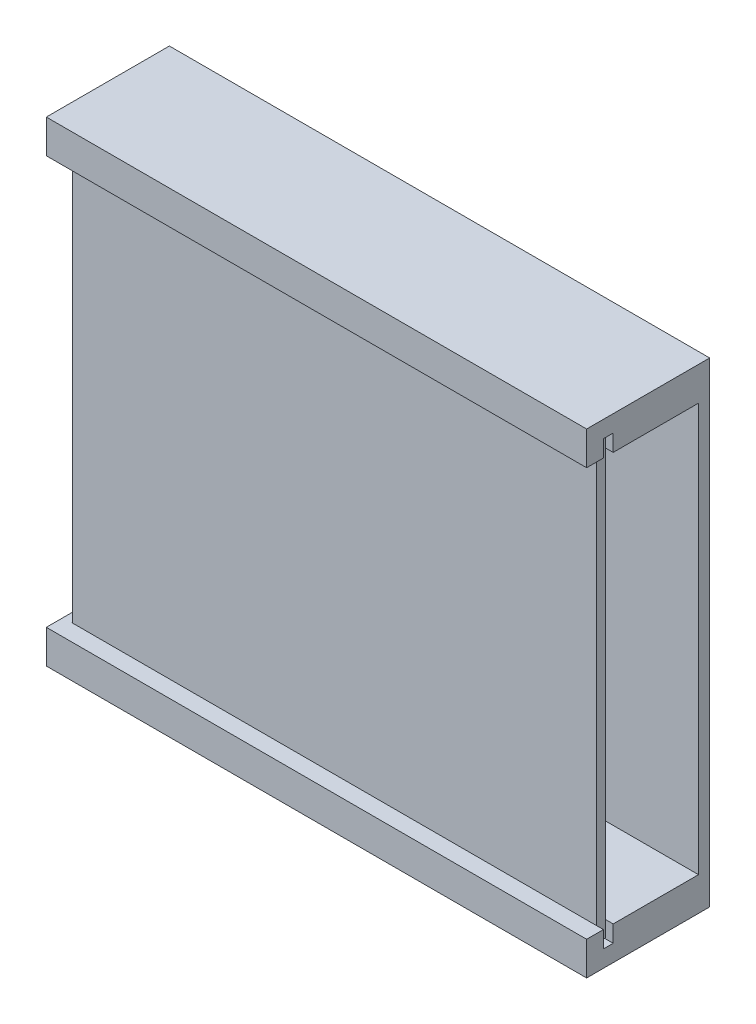
ISO-10303-21;
HEADER;
FILE_DESCRIPTION(('STEP AP214'),'2;1');
FILE_NAME('part.step','',(''),(''),'','','');
FILE_SCHEMA(('AUTOMOTIVE_DESIGN { 1 0 10303 214 1 1 1 1 }'));
ENDSEC;
DATA;
#1=APPLICATION_CONTEXT('core data for automotive mechanical design processes');
#2=APPLICATION_PROTOCOL_DEFINITION('international standard','automotive_design',2000,#1);
#3=PRODUCT_CONTEXT('',#1,'mechanical');
#4=PRODUCT('Part','Part','',(#3));
#5=PRODUCT_RELATED_PRODUCT_CATEGORY('part','',(#4));
#6=PRODUCT_DEFINITION_FORMATION('','',#4);
#7=PRODUCT_DEFINITION_CONTEXT('part definition',#1,'design');
#8=PRODUCT_DEFINITION('design','',#6,#7);
#9=PRODUCT_DEFINITION_SHAPE('','',#8);
#10=(LENGTH_UNIT() NAMED_UNIT(*) SI_UNIT(.MILLI.,.METRE.));
#11=(NAMED_UNIT(*) PLANE_ANGLE_UNIT() SI_UNIT($,.RADIAN.));
#12=(NAMED_UNIT(*) SI_UNIT($,.STERADIAN.) SOLID_ANGLE_UNIT());
#13=UNCERTAINTY_MEASURE_WITH_UNIT(LENGTH_MEASURE(1.E-05),#10,'distance_accuracy_value','');
#14=(GEOMETRIC_REPRESENTATION_CONTEXT(3) GLOBAL_UNCERTAINTY_ASSIGNED_CONTEXT((#13)) GLOBAL_UNIT_ASSIGNED_CONTEXT((#10,
#11,#12)) REPRESENTATION_CONTEXT('',''));
#15=CARTESIAN_POINT('',(0.,0.,0.));
#16=DIRECTION('',(0.,0.,1.));
#17=DIRECTION('',(1.,0.,0.));
#18=AXIS2_PLACEMENT_3D('',#15,#16,#17);
#19=CARTESIAN_POINT('',(130.687,37.8405198294598,1.675));
#20=DIRECTION('',(0.,1.,0.));
#21=DIRECTION('',(0.,0.,1.));
#22=AXIS2_PLACEMENT_3D('',#19,#20,#21);
#23=PLANE('',#22);
#24=DIRECTION('',(0.,0.,-1.));
#25=VECTOR('',#24,1.);
#26=CARTESIAN_POINT('',(35.687,37.8405198294598,1.675));
#27=LINE('',#26,#25);
#28=CARTESIAN_POINT('',(35.687,37.8405198294598,1.675));
#29=VERTEX_POINT('',#28);
#30=CARTESIAN_POINT('',(35.687,37.8405198294598,-0.0749999999999998));
#31=VERTEX_POINT('',#30);
#32=EDGE_CURVE('E12',#29,#31,#27,.T.);
#33=ORIENTED_EDGE('',*,*,#32,.F.);
#34=DIRECTION('',(-1.,0.,0.));
#35=VECTOR('',#34,1.);
#36=CARTESIAN_POINT('',(130.687,37.8405198294598,1.675));
#37=LINE('',#36,#35);
#38=CARTESIAN_POINT('',(130.687,37.8405198294598,1.675));
#39=VERTEX_POINT('',#38);
#40=EDGE_CURVE('E324',#39,#29,#37,.T.);
#41=ORIENTED_EDGE('',*,*,#40,.F.);
#42=DIRECTION('',(0.,0.,-1.));
#43=VECTOR('',#42,1.);
#44=CARTESIAN_POINT('',(130.687,37.8405198294598,1.675));
#45=LINE('',#44,#43);
#46=CARTESIAN_POINT('',(130.687,37.8405198294598,-0.0749999999999996));
#47=VERTEX_POINT('',#46);
#48=EDGE_CURVE('E67',#39,#47,#45,.T.);
#49=ORIENTED_EDGE('',*,*,#48,.T.);
#50=DIRECTION('',(-1.,0.,0.));
#51=VECTOR('',#50,1.);
#52=CARTESIAN_POINT('',(130.687,37.8405198294598,-0.0749999999999996));
#53=LINE('',#52,#51);
#54=EDGE_CURVE('E81',#47,#31,#53,.T.);
#55=ORIENTED_EDGE('',*,*,#54,.T.);
#56=EDGE_LOOP('',(#33,#41,#49,#55));
#57=FACE_BOUND('',#56,.T.);
#58=ADVANCED_FACE('F63',(#57),#23,.T.);
#59=CARTESIAN_POINT('',(130.687,40.8405198294598,1.675));
#60=DIRECTION('',(0.,0.,-1.));
#61=DIRECTION('',(-1.,0.,0.));
#62=AXIS2_PLACEMENT_3D('',#59,#60,#61);
#63=PLANE('',#62);
#64=DIRECTION('',(0.,-1.,0.));
#65=VECTOR('',#64,1.);
#66=CARTESIAN_POINT('',(35.687,40.8405198294598,1.675));
#67=LINE('',#66,#65);
#68=CARTESIAN_POINT('',(35.687,40.8405198294598,1.675));
#69=VERTEX_POINT('',#68);
#70=EDGE_CURVE('E357',#69,#29,#67,.T.);
#71=ORIENTED_EDGE('',*,*,#70,.F.);
#72=DIRECTION('',(-1.,0.,0.));
#73=VECTOR('',#72,1.);
#74=CARTESIAN_POINT('',(130.687,40.8405198294598,1.675));
#75=LINE('',#74,#73);
#76=CARTESIAN_POINT('',(130.687,40.8405198294598,1.675));
#77=VERTEX_POINT('',#76);
#78=EDGE_CURVE('E351',#77,#69,#75,.T.);
#79=ORIENTED_EDGE('',*,*,#78,.F.);
#80=DIRECTION('',(0.,-1.,0.));
#81=VECTOR('',#80,1.);
#82=CARTESIAN_POINT('',(130.687,40.8405198294598,1.675));
#83=LINE('',#82,#81);
#84=EDGE_CURVE('E338',#77,#39,#83,.T.);
#85=ORIENTED_EDGE('',*,*,#84,.T.);
#86=ORIENTED_EDGE('',*,*,#40,.T.);
#87=EDGE_LOOP('',(#71,#79,#85,#86));
#88=FACE_BOUND('',#87,.T.);
#89=ADVANCED_FACE('F395',(#88),#63,.T.);
#90=CARTESIAN_POINT('',(130.687,40.8405198294598,4.675));
#91=DIRECTION('',(0.,1.,0.));
#92=DIRECTION('',(0.,0.,1.));
#93=AXIS2_PLACEMENT_3D('',#90,#91,#92);
#94=PLANE('',#93);
#95=ORIENTED_EDGE('',*,*,#78,.T.);
#96=DIRECTION('',(0.,0.,-1.));
#97=VECTOR('',#96,1.);
#98=CARTESIAN_POINT('',(35.687,40.8405198294598,-15.325));
#99=LINE('',#98,#97);
#100=CARTESIAN_POINT('',(35.687,40.8405198294598,-0.0749999999999987));
#101=VERTEX_POINT('',#100);
#102=EDGE_CURVE('E321',#69,#101,#99,.T.);
#103=ORIENTED_EDGE('',*,*,#102,.T.);
#104=DIRECTION('',(-1.,0.,0.));
#105=VECTOR('',#104,1.);
#106=CARTESIAN_POINT('',(130.687,40.8405198294598,-0.0749999999999992));
#107=LINE('',#106,#105);
#108=CARTESIAN_POINT('',(130.687,40.8405198294598,-0.0749999999999992));
#109=VERTEX_POINT('',#108);
#110=EDGE_CURVE('E89',#109,#101,#107,.T.);
#111=ORIENTED_EDGE('',*,*,#110,.F.);
#112=DIRECTION('',(0.,0.,-1.));
#113=VECTOR('',#112,1.);
#114=CARTESIAN_POINT('',(130.687,40.8405198294598,-0.0749999999999992));
#115=LINE('',#114,#113);
#116=CARTESIAN_POINT('',(130.687,40.8405198294598,-15.325));
#117=VERTEX_POINT('',#116);
#118=EDGE_CURVE('E377',#109,#117,#115,.T.);
#119=ORIENTED_EDGE('',*,*,#118,.T.);
#120=DIRECTION('',(-1.,0.,0.));
#121=VECTOR('',#120,1.);
#122=CARTESIAN_POINT('',(130.687,40.8405198294598,-15.325));
#123=LINE('',#122,#121);
#124=CARTESIAN_POINT('',(112.469351456297,40.8405198294598,-15.325));
#125=VERTEX_POINT('',#124);
#126=EDGE_CURVE('E341',#117,#125,#123,.T.);
#127=ORIENTED_EDGE('',*,*,#126,.T.);
#128=DIRECTION('',(0.,0.,1.));
#129=VECTOR('',#128,1.);
#130=CARTESIAN_POINT('',(112.469351456297,40.8405198294598,-17.325));
#131=LINE('',#130,#129);
#132=CARTESIAN_POINT('',(112.469351456297,40.8405198294598,-17.325));
#133=VERTEX_POINT('',#132);
#134=EDGE_CURVE('E213',#133,#125,#131,.T.);
#135=ORIENTED_EDGE('',*,*,#134,.F.);
#136=DIRECTION('',(1.,0.,0.));
#137=VECTOR('',#136,1.);
#138=CARTESIAN_POINT('',(0.,40.8405198294598,-17.325));
#139=LINE('',#138,#137);
#140=CARTESIAN_POINT('',(47.0493676342301,40.8405198294598,-17.325));
#141=VERTEX_POINT('',#140);
#142=EDGE_CURVE('E205',#141,#133,#139,.T.);
#143=ORIENTED_EDGE('',*,*,#142,.F.);
#144=DIRECTION('',(0.,0.,1.));
#145=VECTOR('',#144,1.);
#146=CARTESIAN_POINT('',(47.0493676342301,40.8405198294598,-17.325));
#147=LINE('',#146,#145);
#148=CARTESIAN_POINT('',(47.0493676342301,40.8405198294598,-15.325));
#149=VERTEX_POINT('',#148);
#150=EDGE_CURVE('E210',#141,#149,#147,.T.);
#151=ORIENTED_EDGE('',*,*,#150,.T.);
#152=CARTESIAN_POINT('',(34.087,40.8405198294598,-15.325));
#153=VERTEX_POINT('',#152);
#154=EDGE_CURVE('E344',#149,#153,#123,.T.);
#155=ORIENTED_EDGE('',*,*,#154,.T.);
#156=DIRECTION('',(0.,0.,-1.));
#157=VECTOR('',#156,1.);
#158=CARTESIAN_POINT('',(34.087,40.8405198294598,-15.325));
#159=LINE('',#158,#157);
#160=CARTESIAN_POINT('',(34.087,40.8405198294598,4.675));
#161=VERTEX_POINT('',#160);
#162=EDGE_CURVE('E302',#161,#153,#159,.T.);
#163=ORIENTED_EDGE('',*,*,#162,.F.);
#164=DIRECTION('',(-1.,0.,0.));
#165=VECTOR('',#164,1.);
#166=CARTESIAN_POINT('',(130.687,40.8405198294598,4.675));
#167=LINE('',#166,#165);
#168=CARTESIAN_POINT('',(130.687,40.8405198294598,4.675));
#169=VERTEX_POINT('',#168);
#170=EDGE_CURVE('E348',#169,#161,#167,.T.);
#171=ORIENTED_EDGE('',*,*,#170,.F.);
#172=DIRECTION('',(0.,0.,-1.));
#173=VECTOR('',#172,1.);
#174=CARTESIAN_POINT('',(130.687,40.8405198294598,4.675));
#175=LINE('',#174,#173);
#176=EDGE_CURVE('E365',#169,#77,#175,.T.);
#177=ORIENTED_EDGE('',*,*,#176,.T.);
#178=EDGE_LOOP('',(#95,#103,#111,#119,#127,#135,#143,#151,#155,#163,#171,#177));
#179=FACE_BOUND('',#178,.T.);
#180=ADVANCED_FACE('F208',(#179),#94,.T.);
#181=CARTESIAN_POINT('',(130.687,34.8405198294598,4.675));
#182=DIRECTION('',(0.,0.,1.));
#183=DIRECTION('',(0.,-1.,0.));
#184=AXIS2_PLACEMENT_3D('',#181,#182,#183);
#185=PLANE('',#184);
#186=ORIENTED_EDGE('',*,*,#170,.T.);
#187=DIRECTION('',(0.,1.,0.));
#188=VECTOR('',#187,1.);
#189=CARTESIAN_POINT('',(34.087,34.8405198294598,4.675));
#190=LINE('',#189,#188);
#191=CARTESIAN_POINT('',(34.087,34.8405198294598,4.675));
#192=VERTEX_POINT('',#191);
#193=EDGE_CURVE('E329',#192,#161,#190,.T.);
#194=ORIENTED_EDGE('',*,*,#193,.F.);
#195=DIRECTION('',(-1.,0.,0.));
#196=VECTOR('',#195,1.);
#197=CARTESIAN_POINT('',(130.687,34.8405198294598,4.675));
#198=LINE('',#197,#196);
#199=CARTESIAN_POINT('',(130.687,34.8405198294598,4.675));
#200=VERTEX_POINT('',#199);
#201=EDGE_CURVE('E345',#200,#192,#198,.T.);
#202=ORIENTED_EDGE('',*,*,#201,.F.);
#203=DIRECTION('',(0.,1.,0.));
#204=VECTOR('',#203,1.);
#205=CARTESIAN_POINT('',(130.687,34.8405198294598,4.675));
#206=LINE('',#205,#204);
#207=EDGE_CURVE('E369',#200,#169,#206,.T.);
#208=ORIENTED_EDGE('',*,*,#207,.T.);
#209=EDGE_LOOP('',(#186,#194,#202,#208));
#210=FACE_BOUND('',#209,.T.);
#211=ADVANCED_FACE('F399',(#210),#185,.T.);
#212=CARTESIAN_POINT('',(130.687,34.8405198294598,-15.325));
#213=DIRECTION('',(0.,-1.,0.));
#214=DIRECTION('',(0.,0.,-1.));
#215=AXIS2_PLACEMENT_3D('',#212,#213,#214);
#216=PLANE('',#215);
#217=ORIENTED_EDGE('',*,*,#201,.T.);
#218=DIRECTION('',(0.,0.,1.));
#219=VECTOR('',#218,1.);
#220=CARTESIAN_POINT('',(34.087,34.8405198294598,-15.325));
#221=LINE('',#220,#219);
#222=CARTESIAN_POINT('',(34.087,34.8405198294598,-17.325));
#223=VERTEX_POINT('',#222);
#224=EDGE_CURVE('E325',#223,#192,#221,.T.);
#225=ORIENTED_EDGE('',*,*,#224,.F.);
#226=DIRECTION('',(-1.,0.,0.));
#227=VECTOR('',#226,1.);
#228=CARTESIAN_POINT('',(0.,34.8405198294598,-17.325));
#229=LINE('',#228,#227);
#230=CARTESIAN_POINT('',(130.687,34.8405198294598,-17.325));
#231=VERTEX_POINT('',#230);
#232=EDGE_CURVE('E406',#231,#223,#229,.T.);
#233=ORIENTED_EDGE('',*,*,#232,.F.);
#234=DIRECTION('',(0.,0.,1.));
#235=VECTOR('',#234,1.);
#236=CARTESIAN_POINT('',(130.687,34.8405198294598,-15.325));
#237=LINE('',#236,#235);
#238=EDGE_CURVE('E373',#231,#200,#237,.T.);
#239=ORIENTED_EDGE('',*,*,#238,.T.);
#240=EDGE_LOOP('',(#217,#225,#233,#239));
#241=FACE_BOUND('',#240,.T.);
#242=ADVANCED_FACE('F402',(#241),#216,.T.);
#243=CARTESIAN_POINT('',(130.687,37.8405198294598,-0.0749999999999996));
#244=DIRECTION('',(0.,0.,1.));
#245=DIRECTION('',(0.,-1.,0.));
#246=AXIS2_PLACEMENT_3D('',#243,#244,#245);
#247=PLANE('',#246);
#248=DIRECTION('',(0.,1.,0.));
#249=VECTOR('',#248,1.);
#250=CARTESIAN_POINT('',(35.687,37.8405198294598,-0.0749999999999996));
#251=LINE('',#250,#249);
#252=EDGE_CURVE('E73',#31,#101,#251,.T.);
#253=ORIENTED_EDGE('',*,*,#252,.F.);
#254=ORIENTED_EDGE('',*,*,#54,.F.);
#255=DIRECTION('',(0.,1.,0.));
#256=VECTOR('',#255,1.);
#257=CARTESIAN_POINT('',(130.687,37.8405198294598,-0.0749999999999996));
#258=LINE('',#257,#256);
#259=EDGE_CURVE('E379',#47,#109,#258,.T.);
#260=ORIENTED_EDGE('',*,*,#259,.T.);
#261=ORIENTED_EDGE('',*,*,#110,.T.);
#262=EDGE_LOOP('',(#253,#254,#260,#261));
#263=FACE_BOUND('',#262,.T.);
#264=ADVANCED_FACE('F568',(#263),#247,.T.);
#265=CARTESIAN_POINT('',(130.687,0.,0.));
#266=DIRECTION('',(1.,0.,0.));
#267=DIRECTION('',(0.,0.,-1.));
#268=AXIS2_PLACEMENT_3D('',#265,#266,#267);
#269=PLANE('',#268);
#270=ORIENTED_EDGE('',*,*,#48,.F.);
#271=ORIENTED_EDGE('',*,*,#84,.F.);
#272=ORIENTED_EDGE('',*,*,#176,.F.);
#273=ORIENTED_EDGE('',*,*,#207,.F.);
#274=ORIENTED_EDGE('',*,*,#238,.F.);
#275=DIRECTION('',(0.,-1.,0.));
#276=VECTOR('',#275,1.);
#277=CARTESIAN_POINT('',(130.687,0.,-17.325));
#278=LINE('',#277,#276);
#279=CARTESIAN_POINT('',(130.687,119.84548017054,-17.325));
#280=VERTEX_POINT('',#279);
#281=EDGE_CURVE('E410',#280,#231,#278,.T.);
#282=ORIENTED_EDGE('',*,*,#281,.F.);
#283=DIRECTION('',(0.,0.,-1.));
#284=VECTOR('',#283,1.);
#285=CARTESIAN_POINT('',(130.687,119.84548017054,-15.325));
#286=LINE('',#285,#284);
#287=CARTESIAN_POINT('',(130.687,119.84548017054,4.675));
#288=VERTEX_POINT('',#287);
#289=EDGE_CURVE('E281',#288,#280,#286,.T.);
#290=ORIENTED_EDGE('',*,*,#289,.F.);
#291=DIRECTION('',(0.,1.,0.));
#292=VECTOR('',#291,1.);
#293=CARTESIAN_POINT('',(130.687,119.84548017054,4.675));
#294=LINE('',#293,#292);
#295=CARTESIAN_POINT('',(130.687,113.84548017054,4.675));
#296=VERTEX_POINT('',#295);
#297=EDGE_CURVE('E277',#296,#288,#294,.T.);
#298=ORIENTED_EDGE('',*,*,#297,.F.);
#299=DIRECTION('',(0.,0.,1.));
#300=VECTOR('',#299,1.);
#301=CARTESIAN_POINT('',(130.687,113.84548017054,4.675));
#302=LINE('',#301,#300);
#303=CARTESIAN_POINT('',(130.687,113.84548017054,1.675));
#304=VERTEX_POINT('',#303);
#305=EDGE_CURVE('E273',#304,#296,#302,.T.);
#306=ORIENTED_EDGE('',*,*,#305,.F.);
#307=DIRECTION('',(0.,-1.,0.));
#308=VECTOR('',#307,1.);
#309=CARTESIAN_POINT('',(130.687,113.84548017054,1.675));
#310=LINE('',#309,#308);
#311=CARTESIAN_POINT('',(130.687,116.84548017054,1.675));
#312=VERTEX_POINT('',#311);
#313=EDGE_CURVE('E269',#312,#304,#310,.T.);
#314=ORIENTED_EDGE('',*,*,#313,.F.);
#315=DIRECTION('',(0.,0.,1.));
#316=VECTOR('',#315,1.);
#317=CARTESIAN_POINT('',(130.687,116.84548017054,1.675));
#318=LINE('',#317,#316);
#319=CARTESIAN_POINT('',(130.687,116.84548017054,-0.0749999999999996));
#320=VERTEX_POINT('',#319);
#321=EDGE_CURVE('E264',#320,#312,#318,.T.);
#322=ORIENTED_EDGE('',*,*,#321,.F.);
#323=DIRECTION('',(0.,1.,0.));
#324=VECTOR('',#323,1.);
#325=CARTESIAN_POINT('',(130.687,116.84548017054,-0.0749999999999996));
#326=LINE('',#325,#324);
#327=CARTESIAN_POINT('',(130.687,113.84548017054,-0.0749999999999992));
#328=VERTEX_POINT('',#327);
#329=EDGE_CURVE('E260',#328,#320,#326,.T.);
#330=ORIENTED_EDGE('',*,*,#329,.F.);
#331=DIRECTION('',(0.,0.,1.));
#332=VECTOR('',#331,1.);
#333=CARTESIAN_POINT('',(130.687,113.84548017054,-0.0749999999999992));
#334=LINE('',#333,#332);
#335=CARTESIAN_POINT('',(130.687,113.84548017054,-15.325));
#336=VERTEX_POINT('',#335);
#337=EDGE_CURVE('E284',#336,#328,#334,.T.);
#338=ORIENTED_EDGE('',*,*,#337,.F.);
#339=DIRECTION('',(0.,-1.,0.));
#340=VECTOR('',#339,1.);
#341=CARTESIAN_POINT('',(130.687,0.,-15.325));
#342=LINE('',#341,#340);
#343=EDGE_CURVE('E230',#336,#117,#342,.T.);
#344=ORIENTED_EDGE('',*,*,#343,.T.);
#345=ORIENTED_EDGE('',*,*,#118,.F.);
#346=ORIENTED_EDGE('',*,*,#259,.F.);
#347=EDGE_LOOP('',(#270,#271,#272,#273,#274,#282,#290,#298,#306,#314,#322,#330,#338,#344,#345,#346));
#348=FACE_BOUND('',#347,.T.);
#349=ADVANCED_FACE('F65',(#348),#269,.T.);
#350=CARTESIAN_POINT('',(35.687,0.,0.));
#351=DIRECTION('',(-1.,0.,0.));
#352=DIRECTION('',(0.,0.,1.));
#353=AXIS2_PLACEMENT_3D('',#350,#351,#352);
#354=PLANE('',#353);
#355=ORIENTED_EDGE('',*,*,#32,.T.);
#356=ORIENTED_EDGE('',*,*,#252,.T.);
#357=ORIENTED_EDGE('',*,*,#102,.F.);
#358=ORIENTED_EDGE('',*,*,#70,.T.);
#359=EDGE_LOOP('',(#355,#356,#357,#358));
#360=FACE_BOUND('',#359,.T.);
#361=ADVANCED_FACE('F561',(#360),#354,.F.);
#362=CARTESIAN_POINT('',(0.,0.,-15.325));
#363=DIRECTION('',(0.,0.,-1.));
#364=DIRECTION('',(-1.,0.,0.));
#365=AXIS2_PLACEMENT_3D('',#362,#363,#364);
#366=PLANE('',#365);
#367=ORIENTED_EDGE('',*,*,#126,.F.);
#368=ORIENTED_EDGE('',*,*,#343,.F.);
#369=DIRECTION('',(-1.,0.,0.));
#370=VECTOR('',#369,1.);
#371=CARTESIAN_POINT('',(130.687,113.84548017054,-15.325));
#372=LINE('',#371,#370);
#373=CARTESIAN_POINT('',(112.469351456297,113.84548017054,-15.325));
#374=VERTEX_POINT('',#373);
#375=EDGE_CURVE('E303',#336,#374,#372,.T.);
#376=ORIENTED_EDGE('',*,*,#375,.T.);
#377=DIRECTION('',(0.,-1.,0.));
#378=VECTOR('',#377,1.);
#379=CARTESIAN_POINT('',(112.469351456297,0.,-15.325));
#380=LINE('',#379,#378);
#381=EDGE_CURVE('E429',#374,#125,#380,.T.);
#382=ORIENTED_EDGE('',*,*,#381,.T.);
#383=EDGE_LOOP('',(#367,#368,#376,#382));
#384=FACE_BOUND('',#383,.T.);
#385=ADVANCED_FACE('F449',(#384),#366,.F.);
#386=CARTESIAN_POINT('',(34.087,0.,0.));
#387=DIRECTION('',(-1.,0.,0.));
#388=DIRECTION('',(0.,0.,1.));
#389=AXIS2_PLACEMENT_3D('',#386,#387,#388);
#390=PLANE('',#389);
#391=ORIENTED_EDGE('',*,*,#224,.T.);
#392=ORIENTED_EDGE('',*,*,#193,.T.);
#393=ORIENTED_EDGE('',*,*,#162,.T.);
#394=DIRECTION('',(0.,1.,0.));
#395=VECTOR('',#394,1.);
#396=CARTESIAN_POINT('',(34.087,0.,-15.325));
#397=LINE('',#396,#395);
#398=CARTESIAN_POINT('',(34.087,113.84548017054,-15.325));
#399=VERTEX_POINT('',#398);
#400=EDGE_CURVE('E433',#153,#399,#397,.T.);
#401=ORIENTED_EDGE('',*,*,#400,.T.);
#402=DIRECTION('',(0.,0.,1.));
#403=VECTOR('',#402,1.);
#404=CARTESIAN_POINT('',(34.087,113.84548017054,-15.325));
#405=LINE('',#404,#403);
#406=CARTESIAN_POINT('',(34.087,113.84548017054,4.675));
#407=VERTEX_POINT('',#406);
#408=EDGE_CURVE('E243',#399,#407,#405,.T.);
#409=ORIENTED_EDGE('',*,*,#408,.T.);
#410=DIRECTION('',(0.,1.,0.));
#411=VECTOR('',#410,1.);
#412=CARTESIAN_POINT('',(34.087,113.84548017054,4.675));
#413=LINE('',#412,#411);
#414=CARTESIAN_POINT('',(34.087,119.84548017054,4.675));
#415=VERTEX_POINT('',#414);
#416=EDGE_CURVE('E252',#407,#415,#413,.T.);
#417=ORIENTED_EDGE('',*,*,#416,.T.);
#418=DIRECTION('',(0.,0.,-1.));
#419=VECTOR('',#418,1.);
#420=CARTESIAN_POINT('',(34.087,119.84548017054,-15.325));
#421=LINE('',#420,#419);
#422=CARTESIAN_POINT('',(34.087,119.84548017054,-17.325));
#423=VERTEX_POINT('',#422);
#424=EDGE_CURVE('E256',#415,#423,#421,.T.);
#425=ORIENTED_EDGE('',*,*,#424,.T.);
#426=DIRECTION('',(0.,1.,0.));
#427=VECTOR('',#426,1.);
#428=CARTESIAN_POINT('',(34.087,0.,-17.325));
#429=LINE('',#428,#427);
#430=EDGE_CURVE('E423',#223,#423,#429,.T.);
#431=ORIENTED_EDGE('',*,*,#430,.F.);
#432=EDGE_LOOP('',(#391,#392,#393,#401,#409,#417,#425,#431));
#433=FACE_BOUND('',#432,.T.);
#434=ADVANCED_FACE('F554',(#433),#390,.T.);
#435=ORIENTED_EDGE('',*,*,#154,.F.);
#436=DIRECTION('',(0.,-1.,0.));
#437=VECTOR('',#436,1.);
#438=CARTESIAN_POINT('',(47.0493676342301,0.,-15.325));
#439=LINE('',#438,#437);
#440=CARTESIAN_POINT('',(47.0493676342301,113.84548017054,-15.325));
#441=VERTEX_POINT('',#440);
#442=EDGE_CURVE('E234',#441,#149,#439,.T.);
#443=ORIENTED_EDGE('',*,*,#442,.F.);
#444=EDGE_CURVE('E306',#441,#399,#372,.T.);
#445=ORIENTED_EDGE('',*,*,#444,.T.);
#446=ORIENTED_EDGE('',*,*,#400,.F.);
#447=EDGE_LOOP('',(#435,#443,#445,#446));
#448=FACE_BOUND('',#447,.T.);
#449=ADVANCED_FACE('F474',(#448),#366,.F.);
#450=CARTESIAN_POINT('',(130.687,116.84548017054,-0.0749999999999996));
#451=DIRECTION('',(0.,0.,1.));
#452=DIRECTION('',(0.,-1.,0.));
#453=AXIS2_PLACEMENT_3D('',#450,#451,#452);
#454=PLANE('',#453);
#455=DIRECTION('',(0.,1.,0.));
#456=VECTOR('',#455,1.);
#457=CARTESIAN_POINT('',(35.687,116.84548017054,-0.0749999999999996));
#458=LINE('',#457,#456);
#459=CARTESIAN_POINT('',(35.687,113.84548017054,-0.0749999999999992));
#460=VERTEX_POINT('',#459);
#461=CARTESIAN_POINT('',(35.687,116.84548017054,-0.0749999999999996));
#462=VERTEX_POINT('',#461);
#463=EDGE_CURVE('E258',#460,#462,#458,.T.);
#464=ORIENTED_EDGE('',*,*,#463,.F.);
#465=DIRECTION('',(-1.,0.,0.));
#466=VECTOR('',#465,1.);
#467=CARTESIAN_POINT('',(130.687,113.84548017054,-0.0749999999999992));
#468=LINE('',#467,#466);
#469=EDGE_CURVE('E299',#328,#460,#468,.T.);
#470=ORIENTED_EDGE('',*,*,#469,.F.);
#471=ORIENTED_EDGE('',*,*,#329,.T.);
#472=DIRECTION('',(-1.,0.,0.));
#473=VECTOR('',#472,1.);
#474=CARTESIAN_POINT('',(130.687,116.84548017054,-0.0749999999999996));
#475=LINE('',#474,#473);
#476=EDGE_CURVE('E288',#320,#462,#475,.T.);
#477=ORIENTED_EDGE('',*,*,#476,.T.);
#478=EDGE_LOOP('',(#464,#470,#471,#477));
#479=FACE_BOUND('',#478,.T.);
#480=ADVANCED_FACE('F456',(#479),#454,.T.);
#481=CARTESIAN_POINT('',(130.687,113.84548017054,-0.0749999999999992));
#482=DIRECTION('',(0.,-1.,0.));
#483=DIRECTION('',(0.,0.,-1.));
#484=AXIS2_PLACEMENT_3D('',#481,#482,#483);
#485=PLANE('',#484);
#486=ORIENTED_EDGE('',*,*,#469,.T.);
#487=DIRECTION('',(0.,0.,1.));
#488=VECTOR('',#487,1.);
#489=CARTESIAN_POINT('',(35.687,113.84548017054,-15.325));
#490=LINE('',#489,#488);
#491=CARTESIAN_POINT('',(35.687,113.84548017054,1.675));
#492=VERTEX_POINT('',#491);
#493=EDGE_CURVE('E236',#460,#492,#490,.T.);
#494=ORIENTED_EDGE('',*,*,#493,.T.);
#495=DIRECTION('',(-1.,0.,0.));
#496=VECTOR('',#495,1.);
#497=CARTESIAN_POINT('',(130.687,113.84548017054,1.675));
#498=LINE('',#497,#496);
#499=EDGE_CURVE('E313',#304,#492,#498,.T.);
#500=ORIENTED_EDGE('',*,*,#499,.F.);
#501=ORIENTED_EDGE('',*,*,#305,.T.);
#502=DIRECTION('',(-1.,0.,0.));
#503=VECTOR('',#502,1.);
#504=CARTESIAN_POINT('',(130.687,113.84548017054,4.675));
#505=LINE('',#504,#503);
#506=EDGE_CURVE('E310',#296,#407,#505,.T.);
#507=ORIENTED_EDGE('',*,*,#506,.T.);
#508=ORIENTED_EDGE('',*,*,#408,.F.);
#509=ORIENTED_EDGE('',*,*,#444,.F.);
#510=DIRECTION('',(0.,0.,1.));
#511=VECTOR('',#510,1.);
#512=CARTESIAN_POINT('',(47.0493676342301,113.84548017054,-17.325));
#513=LINE('',#512,#511);
#514=CARTESIAN_POINT('',(47.0493676342301,113.84548017054,-17.325));
#515=VERTEX_POINT('',#514);
#516=EDGE_CURVE('E416',#515,#441,#513,.T.);
#517=ORIENTED_EDGE('',*,*,#516,.F.);
#518=DIRECTION('',(-1.,0.,0.));
#519=VECTOR('',#518,1.);
#520=CARTESIAN_POINT('',(0.,113.84548017054,-17.325));
#521=LINE('',#520,#519);
#522=CARTESIAN_POINT('',(112.469351456297,113.84548017054,-17.325));
#523=VERTEX_POINT('',#522);
#524=EDGE_CURVE('E225',#523,#515,#521,.T.);
#525=ORIENTED_EDGE('',*,*,#524,.F.);
#526=DIRECTION('',(0.,0.,1.));
#527=VECTOR('',#526,1.);
#528=CARTESIAN_POINT('',(112.469351456297,113.84548017054,-17.325));
#529=LINE('',#528,#527);
#530=EDGE_CURVE('E245',#523,#374,#529,.T.);
#531=ORIENTED_EDGE('',*,*,#530,.T.);
#532=ORIENTED_EDGE('',*,*,#375,.F.);
#533=ORIENTED_EDGE('',*,*,#337,.T.);
#534=EDGE_LOOP('',(#486,#494,#500,#501,#507,#508,#509,#517,#525,#531,#532,#533));
#535=FACE_BOUND('',#534,.T.);
#536=ADVANCED_FACE('F444',(#535),#485,.T.);
#537=CARTESIAN_POINT('',(130.687,119.84548017054,-15.325));
#538=DIRECTION('',(0.,1.,0.));
#539=DIRECTION('',(0.,0.,1.));
#540=AXIS2_PLACEMENT_3D('',#537,#538,#539);
#541=PLANE('',#540);
#542=ORIENTED_EDGE('',*,*,#289,.T.);
#543=DIRECTION('',(1.,0.,0.));
#544=VECTOR('',#543,1.);
#545=CARTESIAN_POINT('',(0.,119.84548017054,-17.325));
#546=LINE('',#545,#544);
#547=EDGE_CURVE('E414',#423,#280,#546,.T.);
#548=ORIENTED_EDGE('',*,*,#547,.F.);
#549=ORIENTED_EDGE('',*,*,#424,.F.);
#550=DIRECTION('',(-1.,0.,0.));
#551=VECTOR('',#550,1.);
#552=CARTESIAN_POINT('',(130.687,119.84548017054,4.675));
#553=LINE('',#552,#551);
#554=EDGE_CURVE('E307',#288,#415,#553,.T.);
#555=ORIENTED_EDGE('',*,*,#554,.F.);
#556=EDGE_LOOP('',(#542,#548,#549,#555));
#557=FACE_BOUND('',#556,.T.);
#558=ADVANCED_FACE('F553',(#557),#541,.T.);
#559=CARTESIAN_POINT('',(130.687,119.84548017054,4.675));
#560=DIRECTION('',(0.,0.,1.));
#561=DIRECTION('',(0.,-1.,0.));
#562=AXIS2_PLACEMENT_3D('',#559,#560,#561);
#563=PLANE('',#562);
#564=ORIENTED_EDGE('',*,*,#554,.T.);
#565=ORIENTED_EDGE('',*,*,#416,.F.);
#566=ORIENTED_EDGE('',*,*,#506,.F.);
#567=ORIENTED_EDGE('',*,*,#297,.T.);
#568=EDGE_LOOP('',(#564,#565,#566,#567));
#569=FACE_BOUND('',#568,.T.);
#570=ADVANCED_FACE('F467',(#569),#563,.T.);
#571=CARTESIAN_POINT('',(130.687,113.84548017054,1.675));
#572=DIRECTION('',(0.,0.,-1.));
#573=DIRECTION('',(-1.,0.,0.));
#574=AXIS2_PLACEMENT_3D('',#571,#572,#573);
#575=PLANE('',#574);
#576=DIRECTION('',(0.,-1.,0.));
#577=VECTOR('',#576,1.);
#578=CARTESIAN_POINT('',(35.687,113.84548017054,1.675));
#579=LINE('',#578,#577);
#580=CARTESIAN_POINT('',(35.687,116.84548017054,1.675));
#581=VERTEX_POINT('',#580);
#582=EDGE_CURVE('E265',#581,#492,#579,.T.);
#583=ORIENTED_EDGE('',*,*,#582,.F.);
#584=DIRECTION('',(-1.,0.,0.));
#585=VECTOR('',#584,1.);
#586=CARTESIAN_POINT('',(130.687,116.84548017054,1.675));
#587=LINE('',#586,#585);
#588=EDGE_CURVE('E316',#312,#581,#587,.T.);
#589=ORIENTED_EDGE('',*,*,#588,.F.);
#590=ORIENTED_EDGE('',*,*,#313,.T.);
#591=ORIENTED_EDGE('',*,*,#499,.T.);
#592=EDGE_LOOP('',(#583,#589,#590,#591));
#593=FACE_BOUND('',#592,.T.);
#594=ADVANCED_FACE('F462',(#593),#575,.T.);
#595=CARTESIAN_POINT('',(130.687,116.84548017054,1.675));
#596=DIRECTION('',(0.,-1.,0.));
#597=DIRECTION('',(0.,0.,-1.));
#598=AXIS2_PLACEMENT_3D('',#595,#596,#597);
#599=PLANE('',#598);
#600=DIRECTION('',(0.,0.,1.));
#601=VECTOR('',#600,1.);
#602=CARTESIAN_POINT('',(35.687,116.84548017054,1.675));
#603=LINE('',#602,#601);
#604=EDGE_CURVE('E292',#462,#581,#603,.T.);
#605=ORIENTED_EDGE('',*,*,#604,.F.);
#606=ORIENTED_EDGE('',*,*,#476,.F.);
#607=ORIENTED_EDGE('',*,*,#321,.T.);
#608=ORIENTED_EDGE('',*,*,#588,.T.);
#609=EDGE_LOOP('',(#605,#606,#607,#608));
#610=FACE_BOUND('',#609,.T.);
#611=ADVANCED_FACE('F652',(#610),#599,.T.);
#612=CARTESIAN_POINT('',(35.687,0.,0.));
#613=DIRECTION('',(-1.,0.,0.));
#614=DIRECTION('',(0.,0.,1.));
#615=AXIS2_PLACEMENT_3D('',#612,#613,#614);
#616=PLANE('',#615);
#617=ORIENTED_EDGE('',*,*,#493,.F.);
#618=ORIENTED_EDGE('',*,*,#463,.T.);
#619=ORIENTED_EDGE('',*,*,#604,.T.);
#620=ORIENTED_EDGE('',*,*,#582,.T.);
#621=EDGE_LOOP('',(#617,#618,#619,#620));
#622=FACE_BOUND('',#621,.T.);
#623=ADVANCED_FACE('F459',(#622),#616,.F.);
#624=CARTESIAN_POINT('',(47.0493676342301,0.,-17.325));
#625=DIRECTION('',(-1.,0.,0.));
#626=DIRECTION('',(0.,0.,1.));
#627=AXIS2_PLACEMENT_3D('',#624,#625,#626);
#628=PLANE('',#627);
#629=ORIENTED_EDGE('',*,*,#442,.T.);
#630=ORIENTED_EDGE('',*,*,#150,.F.);
#631=DIRECTION('',(0.,-1.,0.));
#632=VECTOR('',#631,1.);
#633=CARTESIAN_POINT('',(47.0493676342301,0.,-17.325));
#634=LINE('',#633,#632);
#635=EDGE_CURVE('E219',#515,#141,#634,.T.);
#636=ORIENTED_EDGE('',*,*,#635,.F.);
#637=ORIENTED_EDGE('',*,*,#516,.T.);
#638=EDGE_LOOP('',(#629,#630,#636,#637));
#639=FACE_BOUND('',#638,.T.);
#640=ADVANCED_FACE('F232',(#639),#628,.F.);
#641=CARTESIAN_POINT('',(112.469351456297,0.,-17.325));
#642=DIRECTION('',(-1.,0.,0.));
#643=DIRECTION('',(0.,0.,1.));
#644=AXIS2_PLACEMENT_3D('',#641,#642,#643);
#645=PLANE('',#644);
#646=ORIENTED_EDGE('',*,*,#381,.F.);
#647=ORIENTED_EDGE('',*,*,#530,.F.);
#648=DIRECTION('',(0.,-1.,0.));
#649=VECTOR('',#648,1.);
#650=CARTESIAN_POINT('',(112.469351456297,0.,-17.325));
#651=LINE('',#650,#649);
#652=EDGE_CURVE('E218',#523,#133,#651,.T.);
#653=ORIENTED_EDGE('',*,*,#652,.T.);
#654=ORIENTED_EDGE('',*,*,#134,.T.);
#655=EDGE_LOOP('',(#646,#647,#653,#654));
#656=FACE_BOUND('',#655,.T.);
#657=ADVANCED_FACE('F447',(#656),#645,.T.);
#658=CARTESIAN_POINT('',(0.,0.,-17.325));
#659=DIRECTION('',(0.,0.,-1.));
#660=DIRECTION('',(-1.,0.,0.));
#661=AXIS2_PLACEMENT_3D('',#658,#659,#660);
#662=PLANE('',#661);
#663=ORIENTED_EDGE('',*,*,#635,.T.);
#664=ORIENTED_EDGE('',*,*,#142,.T.);
#665=ORIENTED_EDGE('',*,*,#652,.F.);
#666=ORIENTED_EDGE('',*,*,#524,.T.);
#667=EDGE_LOOP('',(#663,#664,#665,#666));
#668=FACE_BOUND('',#667,.T.);
#669=ORIENTED_EDGE('',*,*,#232,.T.);
#670=ORIENTED_EDGE('',*,*,#430,.T.);
#671=ORIENTED_EDGE('',*,*,#547,.T.);
#672=ORIENTED_EDGE('',*,*,#281,.T.);
#673=EDGE_LOOP('',(#669,#670,#671,#672));
#674=FACE_BOUND('',#673,.T.);
#675=ADVANCED_FACE('F222',(#668,#674),#662,.T.);
#676=CLOSED_SHELL('',(#58,#89,#180,#211,#242,#264,#349,#361,#385,#434,#449,#480,#536,#558,#570,
#594,#611,#623,#640,#657,#675));
#677=MANIFOLD_SOLID_BREP('B2',#676);
#678=CARTESIAN_POINT('',(129.413,116.586,1.6));
#679=DIRECTION('',(-1.,0.,0.));
#680=DIRECTION('',(0.,0.,1.));
#681=AXIS2_PLACEMENT_3D('',#678,#679,#680);
#682=PLANE('',#681);
#683=DIRECTION('',(0.,1.,0.));
#684=VECTOR('',#683,1.);
#685=CARTESIAN_POINT('',(129.413,116.586,0.));
#686=LINE('',#685,#684);
#687=CARTESIAN_POINT('',(129.413,38.1,0.));
#688=VERTEX_POINT('',#687);
#689=CARTESIAN_POINT('',(129.413,116.586,0.));
#690=VERTEX_POINT('',#689);
#691=EDGE_CURVE('E1023',#688,#690,#686,.T.);
#692=ORIENTED_EDGE('',*,*,#691,.T.);
#693=DIRECTION('',(0.,0.,-1.));
#694=VECTOR('',#693,1.);
#695=CARTESIAN_POINT('',(129.413,116.586,1.6));
#696=LINE('',#695,#694);
#697=CARTESIAN_POINT('',(129.413,116.586,1.6));
#698=VERTEX_POINT('',#697);
#699=EDGE_CURVE('E61',#698,#690,#696,.T.);
#700=ORIENTED_EDGE('',*,*,#699,.F.);
#701=DIRECTION('',(0.,1.,0.));
#702=VECTOR('',#701,1.);
#703=CARTESIAN_POINT('',(129.413,116.586,1.6));
#704=LINE('',#703,#702);
#705=CARTESIAN_POINT('',(129.413,38.1,1.6));
#706=VERTEX_POINT('',#705);
#707=EDGE_CURVE('E1006',#706,#698,#704,.T.);
#708=ORIENTED_EDGE('',*,*,#707,.F.);
#709=DIRECTION('',(0.,0.,-1.));
#710=VECTOR('',#709,1.);
#711=CARTESIAN_POINT('',(129.413,38.1,1.6));
#712=LINE('',#711,#710);
#713=EDGE_CURVE('E1019',#706,#688,#712,.T.);
#714=ORIENTED_EDGE('',*,*,#713,.T.);
#715=EDGE_LOOP('',(#692,#700,#708,#714));
#716=FACE_BOUND('',#715,.T.);
#717=ADVANCED_FACE('F954',(#716),#682,.F.);
#718=CARTESIAN_POINT('',(129.413,116.586,1.6));
#719=DIRECTION('',(0.,-1.,0.));
#720=DIRECTION('',(0.,0.,-1.));
#721=AXIS2_PLACEMENT_3D('',#718,#719,#720);
#722=PLANE('',#721);
#723=DIRECTION('',(-1.,0.,0.));
#724=VECTOR('',#723,1.);
#725=CARTESIAN_POINT('',(129.413,116.586,0.));
#726=LINE('',#725,#724);
#727=CARTESIAN_POINT('',(35.687,116.586,0.));
#728=VERTEX_POINT('',#727);
#729=EDGE_CURVE('E1011',#690,#728,#726,.T.);
#730=ORIENTED_EDGE('',*,*,#729,.T.);
#731=DIRECTION('',(0.,0.,-1.));
#732=VECTOR('',#731,1.);
#733=CARTESIAN_POINT('',(35.687,116.586,1.6));
#734=LINE('',#733,#732);
#735=CARTESIAN_POINT('',(35.687,116.586,1.6));
#736=VERTEX_POINT('',#735);
#737=EDGE_CURVE('E963',#736,#728,#734,.T.);
#738=ORIENTED_EDGE('',*,*,#737,.F.);
#739=DIRECTION('',(-1.,0.,0.));
#740=VECTOR('',#739,1.);
#741=CARTESIAN_POINT('',(129.413,116.586,1.6));
#742=LINE('',#741,#740);
#743=EDGE_CURVE('E1001',#698,#736,#742,.T.);
#744=ORIENTED_EDGE('',*,*,#743,.F.);
#745=ORIENTED_EDGE('',*,*,#699,.T.);
#746=EDGE_LOOP('',(#730,#738,#744,#745));
#747=FACE_BOUND('',#746,.T.);
#748=ADVANCED_FACE('F1010',(#747),#722,.F.);
#749=CARTESIAN_POINT('',(35.687,116.586,1.6));
#750=DIRECTION('',(1.,0.,0.));
#751=DIRECTION('',(0.,0.,-1.));
#752=AXIS2_PLACEMENT_3D('',#749,#750,#751);
#753=PLANE('',#752);
#754=DIRECTION('',(0.,-1.,0.));
#755=VECTOR('',#754,1.);
#756=CARTESIAN_POINT('',(35.687,116.586,0.));
#757=LINE('',#756,#755);
#758=CARTESIAN_POINT('',(35.687,38.1,0.));
#759=VERTEX_POINT('',#758);
#760=EDGE_CURVE('E988',#728,#759,#757,.T.);
#761=ORIENTED_EDGE('',*,*,#760,.T.);
#762=DIRECTION('',(0.,0.,-1.));
#763=VECTOR('',#762,1.);
#764=CARTESIAN_POINT('',(35.687,38.1,1.6));
#765=LINE('',#764,#763);
#766=CARTESIAN_POINT('',(35.687,38.1,1.6));
#767=VERTEX_POINT('',#766);
#768=EDGE_CURVE('E1013',#767,#759,#765,.T.);
#769=ORIENTED_EDGE('',*,*,#768,.F.);
#770=DIRECTION('',(0.,-1.,0.));
#771=VECTOR('',#770,1.);
#772=CARTESIAN_POINT('',(35.687,116.586,1.6));
#773=LINE('',#772,#771);
#774=EDGE_CURVE('E1004',#736,#767,#773,.T.);
#775=ORIENTED_EDGE('',*,*,#774,.F.);
#776=ORIENTED_EDGE('',*,*,#737,.T.);
#777=EDGE_LOOP('',(#761,#769,#775,#776));
#778=FACE_BOUND('',#777,.T.);
#779=ADVANCED_FACE('F1014',(#778),#753,.F.);
#780=CARTESIAN_POINT('',(129.413,38.1,1.6));
#781=DIRECTION('',(0.,1.,0.));
#782=DIRECTION('',(0.,0.,1.));
#783=AXIS2_PLACEMENT_3D('',#780,#781,#782);
#784=PLANE('',#783);
#785=DIRECTION('',(1.,0.,0.));
#786=VECTOR('',#785,1.);
#787=CARTESIAN_POINT('',(129.413,38.1,0.));
#788=LINE('',#787,#786);
#789=EDGE_CURVE('E994',#759,#688,#788,.T.);
#790=ORIENTED_EDGE('',*,*,#789,.T.);
#791=ORIENTED_EDGE('',*,*,#713,.F.);
#792=DIRECTION('',(1.,0.,0.));
#793=VECTOR('',#792,1.);
#794=CARTESIAN_POINT('',(129.413,38.1,1.6));
#795=LINE('',#794,#793);
#796=EDGE_CURVE('E971',#767,#706,#795,.T.);
#797=ORIENTED_EDGE('',*,*,#796,.F.);
#798=ORIENTED_EDGE('',*,*,#768,.T.);
#799=EDGE_LOOP('',(#790,#791,#797,#798));
#800=FACE_BOUND('',#799,.T.);
#801=ADVANCED_FACE('F1037',(#800),#784,.F.);
#802=CARTESIAN_POINT('',(0.,0.,1.6));
#803=DIRECTION('',(0.,0.,-1.));
#804=DIRECTION('',(-1.,0.,0.));
#805=AXIS2_PLACEMENT_3D('',#802,#803,#804);
#806=PLANE('',#805);
#807=ORIENTED_EDGE('',*,*,#707,.T.);
#808=ORIENTED_EDGE('',*,*,#743,.T.);
#809=ORIENTED_EDGE('',*,*,#774,.T.);
#810=ORIENTED_EDGE('',*,*,#796,.T.);
#811=EDGE_LOOP('',(#807,#808,#809,#810));
#812=FACE_BOUND('',#811,.T.);
#813=ADVANCED_FACE('F1002',(#812),#806,.F.);
#814=CARTESIAN_POINT('',(0.,0.,0.));
#815=DIRECTION('',(0.,0.,-1.));
#816=DIRECTION('',(-1.,0.,0.));
#817=AXIS2_PLACEMENT_3D('',#814,#815,#816);
#818=PLANE('',#817);
#819=ORIENTED_EDGE('',*,*,#691,.F.);
#820=ORIENTED_EDGE('',*,*,#789,.F.);
#821=ORIENTED_EDGE('',*,*,#760,.F.);
#822=ORIENTED_EDGE('',*,*,#729,.F.);
#823=EDGE_LOOP('',(#819,#820,#821,#822));
#824=FACE_BOUND('',#823,.T.);
#825=ADVANCED_FACE('F1040',(#824),#818,.T.);
#826=CLOSED_SHELL('',(#717,#748,#779,#801,#813,#825));
#827=MANIFOLD_SOLID_BREP('B6',#826);
#828=ADVANCED_BREP_SHAPE_REPRESENTATION('',(#18,#677,#827),#14);
#829=SHAPE_DEFINITION_REPRESENTATION(#9,#828);
ENDSEC;
END-ISO-10303-21;
